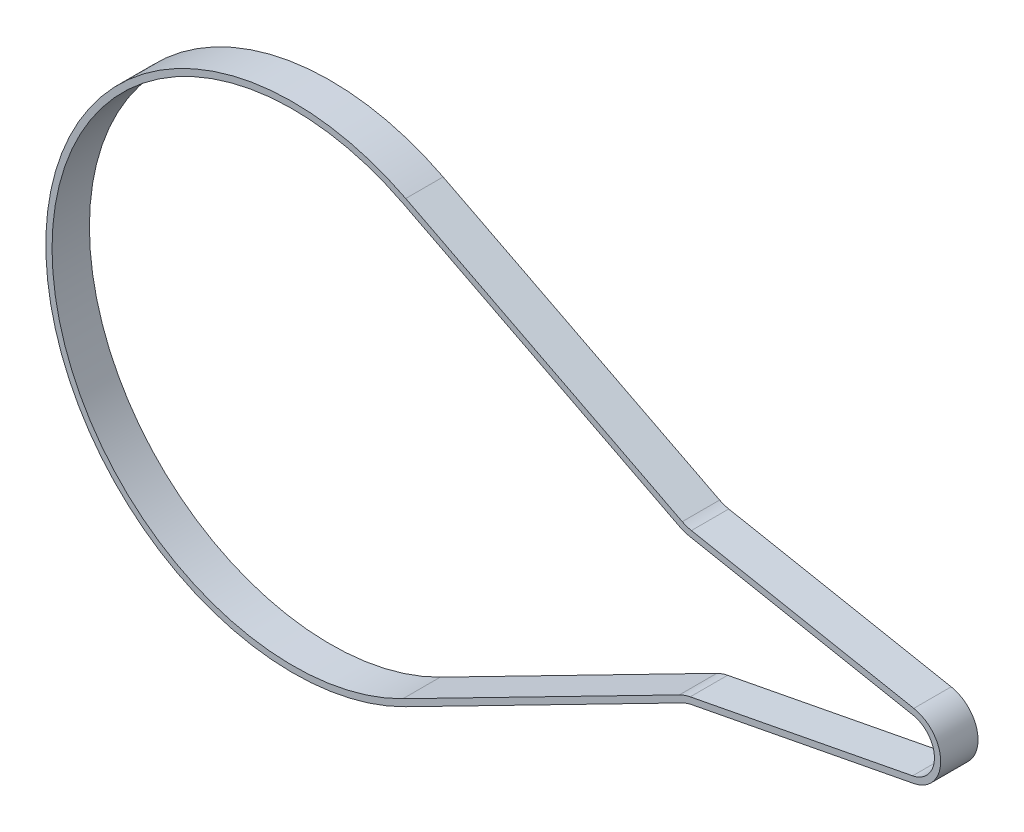
ISO-10303-21;
HEADER;
FILE_DESCRIPTION(('STEP AP214'),'2;1');
FILE_NAME('part.step','',(''),(''),'','','');
FILE_SCHEMA(('AUTOMOTIVE_DESIGN { 1 0 10303 214 1 1 1 1 }'));
ENDSEC;
DATA;
#1=APPLICATION_CONTEXT('core data for automotive mechanical design processes');
#2=APPLICATION_PROTOCOL_DEFINITION('international standard','automotive_design',2000,#1);
#3=PRODUCT_CONTEXT('',#1,'mechanical');
#4=PRODUCT('Part','Part','',(#3));
#5=PRODUCT_RELATED_PRODUCT_CATEGORY('part','',(#4));
#6=PRODUCT_DEFINITION_FORMATION('','',#4);
#7=PRODUCT_DEFINITION_CONTEXT('part definition',#1,'design');
#8=PRODUCT_DEFINITION('design','',#6,#7);
#9=PRODUCT_DEFINITION_SHAPE('','',#8);
#10=(LENGTH_UNIT() NAMED_UNIT(*) SI_UNIT(.MILLI.,.METRE.));
#11=(NAMED_UNIT(*) PLANE_ANGLE_UNIT() SI_UNIT($,.RADIAN.));
#12=(NAMED_UNIT(*) SI_UNIT($,.STERADIAN.) SOLID_ANGLE_UNIT());
#13=UNCERTAINTY_MEASURE_WITH_UNIT(LENGTH_MEASURE(1.E-05),#10,'distance_accuracy_value','');
#14=(GEOMETRIC_REPRESENTATION_CONTEXT(3) GLOBAL_UNCERTAINTY_ASSIGNED_CONTEXT((#13)) GLOBAL_UNIT_ASSIGNED_CONTEXT((#10,
#11,#12)) REPRESENTATION_CONTEXT('',''));
#15=CARTESIAN_POINT('',(0.,0.,0.));
#16=DIRECTION('',(0.,0.,1.));
#17=DIRECTION('',(1.,0.,0.));
#18=AXIS2_PLACEMENT_3D('',#15,#16,#17);
#19=CARTESIAN_POINT('',(-1.11022302462516E-13,35.0000000000002,3.));
#20=DIRECTION('',(0.,0.,1.));
#21=DIRECTION('',(1.,0.,0.));
#22=AXIS2_PLACEMENT_3D('',#19,#20,#21);
#23=PLANE('',#22);
#24=CARTESIAN_POINT('',(-1.11022302462516E-13,35.0000000000002,3.));
#25=DIRECTION('',(0.,0.,1.));
#26=DIRECTION('',(1.,0.,0.));
#27=AXIS2_PLACEMENT_3D('',#24,#25,#26);
#28=CIRCLE('',#27,5.5);
#29=CARTESIAN_POINT('',(-1.0393737461369,29.5991017213949,3.));
#30=VERTEX_POINT('',#29);
#31=CARTESIAN_POINT('',(-2.50670970782606,30.1044503433537,3.));
#32=VERTEX_POINT('',#31);
#33=EDGE_CURVE('E263',#30,#32,#28,.F.);
#34=ORIENTED_EDGE('',*,*,#33,.T.);
#35=DIRECTION('',(-0.89009993757208,0.455765401422902,0.));
#36=VECTOR('',#35,1.);
#37=CARTESIAN_POINT('',(-46.9054299154087,52.8383026715181,3.));
#38=LINE('',#37,#36);
#39=CARTESIAN_POINT('',(-46.9054299154087,52.8383026715181,3.));
#40=VERTEX_POINT('',#39);
#41=EDGE_CURVE('E266',#32,#40,#38,.T.);
#42=ORIENTED_EDGE('',*,*,#41,.T.);
#43=CARTESIAN_POINT('',(-65.0000000000001,17.5000000000002,3.));
#44=DIRECTION('',(0.,0.,1.));
#45=DIRECTION('',(1.,0.,0.));
#46=AXIS2_PLACEMENT_3D('',#43,#44,#45);
#47=CIRCLE('',#46,39.7015);
#48=CARTESIAN_POINT('',(-46.9054299154089,-17.8383026715178,3.));
#49=VERTEX_POINT('',#48);
#50=EDGE_CURVE('E269',#40,#49,#47,.T.);
#51=ORIENTED_EDGE('',*,*,#50,.T.);
#52=DIRECTION('',(0.890099937572082,0.455765401422898,0.));
#53=VECTOR('',#52,1.);
#54=CARTESIAN_POINT('',(-2.50670970782594,4.89554965664645,3.));
#55=LINE('',#54,#53);
#56=CARTESIAN_POINT('',(-2.50670970782594,4.89554965664645,3.));
#57=VERTEX_POINT('',#56);
#58=EDGE_CURVE('E271',#49,#57,#55,.T.);
#59=ORIENTED_EDGE('',*,*,#58,.T.);
#60=CARTESIAN_POINT('',(0.,0.,3.));
#61=DIRECTION('',(0.,0.,1.));
#62=DIRECTION('',(1.,0.,0.));
#63=AXIS2_PLACEMENT_3D('',#60,#61,#62);
#64=CIRCLE('',#63,5.5);
#65=CARTESIAN_POINT('',(-1.03937374613682,5.40089827860528,3.));
#66=VERTEX_POINT('',#65);
#67=EDGE_CURVE('E273',#57,#66,#64,.F.);
#68=ORIENTED_EDGE('',*,*,#67,.T.);
#69=DIRECTION('',(0.981981505200961,0.188977044752149,0.));
#70=VECTOR('',#69,1.);
#71=CARTESIAN_POINT('',(34.6722280006932,12.2734034385681,3.));
#72=LINE('',#71,#70);
#73=CARTESIAN_POINT('',(34.6722280006932,12.2734034385681,3.));
#74=VERTEX_POINT('',#73);
#75=EDGE_CURVE('E275',#66,#74,#72,.T.);
#76=ORIENTED_EDGE('',*,*,#75,.T.);
#77=CARTESIAN_POINT('',(33.6663976799999,17.5000000000002,3.));
#78=DIRECTION('',(0.,0.,1.));
#79=DIRECTION('',(1.,0.,0.));
#80=AXIS2_PLACEMENT_3D('',#77,#78,#79);
#81=CIRCLE('',#80,5.3225);
#82=CARTESIAN_POINT('',(34.6722280006932,22.7265965614323,3.));
#83=VERTEX_POINT('',#82);
#84=EDGE_CURVE('E277',#74,#83,#81,.T.);
#85=ORIENTED_EDGE('',*,*,#84,.T.);
#86=DIRECTION('',(-0.981981505200962,0.188977044752144,0.));
#87=VECTOR('',#86,1.);
#88=CARTESIAN_POINT('',(-1.0393737461369,29.5991017213949,3.));
#89=LINE('',#88,#87);
#90=EDGE_CURVE('E279',#83,#30,#89,.T.);
#91=ORIENTED_EDGE('',*,*,#90,.T.);
#92=EDGE_LOOP('',(#34,#42,#51,#59,#68,#76,#85,#91));
#93=FACE_BOUND('',#92,.T.);
#94=DIRECTION('',(-0.89009993757208,0.455765401422902,0.));
#95=VECTOR('',#94,1.);
#96=CARTESIAN_POINT('',(-47.3611953168316,51.9482027339461,3.));
#97=LINE('',#96,#95);
#98=CARTESIAN_POINT('',(-2.96247510924898,29.2143504057817,3.));
#99=VERTEX_POINT('',#98);
#100=CARTESIAN_POINT('',(-47.3611953168316,51.9482027339461,3.));
#101=VERTEX_POINT('',#100);
#102=EDGE_CURVE('E206',#99,#101,#97,.T.);
#103=ORIENTED_EDGE('',*,*,#102,.F.);
#104=CARTESIAN_POINT('',(-1.11022302462516E-13,35.0000000000002,3.));
#105=DIRECTION('',(0.,0.,-1.));
#106=DIRECTION('',(1.,0.,0.));
#107=AXIS2_PLACEMENT_3D('',#104,#105,#106);
#108=CIRCLE('',#107,6.5);
#109=CARTESIAN_POINT('',(-1.22835079088904,28.6171202161939,3.));
#110=VERTEX_POINT('',#109);
#111=EDGE_CURVE('E198',#110,#99,#108,.T.);
#112=ORIENTED_EDGE('',*,*,#111,.F.);
#113=DIRECTION('',(-0.981981505200962,0.188977044752143,0.));
#114=VECTOR('',#113,1.);
#115=CARTESIAN_POINT('',(-1.22835079088904,28.6171202161939,3.));
#116=LINE('',#115,#114);
#117=CARTESIAN_POINT('',(34.4832509559411,21.7446150562313,3.));
#118=VERTEX_POINT('',#117);
#119=EDGE_CURVE('E231',#118,#110,#116,.T.);
#120=ORIENTED_EDGE('',*,*,#119,.F.);
#121=CARTESIAN_POINT('',(33.6663976799999,17.5000000000002,3.));
#122=DIRECTION('',(0.,0.,1.));
#123=DIRECTION('',(-1.,0.,0.));
#124=AXIS2_PLACEMENT_3D('',#121,#122,#123);
#125=CIRCLE('',#124,4.3225);
#126=CARTESIAN_POINT('',(34.4832509559411,13.255384943769,3.));
#127=VERTEX_POINT('',#126);
#128=EDGE_CURVE('E229',#127,#118,#125,.T.);
#129=ORIENTED_EDGE('',*,*,#128,.F.);
#130=DIRECTION('',(0.981981505200961,0.188977044752149,0.));
#131=VECTOR('',#130,1.);
#132=CARTESIAN_POINT('',(34.4832509559411,13.255384943769,3.));
#133=LINE('',#132,#131);
#134=CARTESIAN_POINT('',(-1.22835079088897,6.38287978380624,3.));
#135=VERTEX_POINT('',#134);
#136=EDGE_CURVE('E227',#135,#127,#133,.T.);
#137=ORIENTED_EDGE('',*,*,#136,.F.);
#138=CARTESIAN_POINT('',(0.,0.,3.));
#139=DIRECTION('',(0.,0.,-1.));
#140=DIRECTION('',(1.,0.,0.));
#141=AXIS2_PLACEMENT_3D('',#138,#139,#140);
#142=CIRCLE('',#141,6.5);
#143=CARTESIAN_POINT('',(-2.96247510924884,5.78564959421853,3.));
#144=VERTEX_POINT('',#143);
#145=EDGE_CURVE('E225',#144,#135,#142,.T.);
#146=ORIENTED_EDGE('',*,*,#145,.F.);
#147=DIRECTION('',(0.890099937572082,0.455765401422898,0.));
#148=VECTOR('',#147,1.);
#149=CARTESIAN_POINT('',(-2.96247510924884,5.78564959421853,3.));
#150=LINE('',#149,#148);
#151=CARTESIAN_POINT('',(-47.3611953168318,-16.9482027339457,3.));
#152=VERTEX_POINT('',#151);
#153=EDGE_CURVE('E221',#152,#144,#150,.T.);
#154=ORIENTED_EDGE('',*,*,#153,.F.);
#155=CARTESIAN_POINT('',(-65.0000000000001,17.5000000000002,3.));
#156=DIRECTION('',(0.,0.,1.));
#157=DIRECTION('',(-1.,0.,0.));
#158=AXIS2_PLACEMENT_3D('',#155,#156,#157);
#159=CIRCLE('',#158,38.7015);
#160=EDGE_CURVE('E219',#101,#152,#159,.T.);
#161=ORIENTED_EDGE('',*,*,#160,.F.);
#162=EDGE_LOOP('',(#103,#112,#120,#129,#137,#146,#154,#161));
#163=FACE_BOUND('',#162,.T.);
#164=ADVANCED_FACE('F85',(#93,#163),#23,.T.);
#165=CARTESIAN_POINT('',(-1.11022302462516E-13,35.0000000000002,-3.));
#166=DIRECTION('',(0.,0.,1.));
#167=DIRECTION('',(1.,0.,0.));
#168=AXIS2_PLACEMENT_3D('',#165,#166,#167);
#169=PLANE('',#168);
#170=CARTESIAN_POINT('',(-1.11022302462516E-13,35.0000000000002,-3.));
#171=DIRECTION('',(0.,0.,1.));
#172=DIRECTION('',(1.,0.,0.));
#173=AXIS2_PLACEMENT_3D('',#170,#171,#172);
#174=CIRCLE('',#173,5.5);
#175=CARTESIAN_POINT('',(-1.0393737461369,29.5991017213949,-3.));
#176=VERTEX_POINT('',#175);
#177=CARTESIAN_POINT('',(-2.50670970782606,30.1044503433537,-3.));
#178=VERTEX_POINT('',#177);
#179=EDGE_CURVE('E214',#176,#178,#174,.F.);
#180=ORIENTED_EDGE('',*,*,#179,.F.);
#181=DIRECTION('',(-0.981981505200962,0.188977044752144,0.));
#182=VECTOR('',#181,1.);
#183=CARTESIAN_POINT('',(-1.0393737461369,29.5991017213949,-3.));
#184=LINE('',#183,#182);
#185=CARTESIAN_POINT('',(34.6722280006932,22.7265965614323,-3.));
#186=VERTEX_POINT('',#185);
#187=EDGE_CURVE('E267',#186,#176,#184,.T.);
#188=ORIENTED_EDGE('',*,*,#187,.F.);
#189=CARTESIAN_POINT('',(33.6663976799999,17.5000000000002,-3.));
#190=DIRECTION('',(0.,0.,1.));
#191=DIRECTION('',(1.,0.,0.));
#192=AXIS2_PLACEMENT_3D('',#189,#190,#191);
#193=CIRCLE('',#192,5.3225);
#194=CARTESIAN_POINT('',(34.6722280006932,12.2734034385681,-3.));
#195=VERTEX_POINT('',#194);
#196=EDGE_CURVE('E294',#195,#186,#193,.T.);
#197=ORIENTED_EDGE('',*,*,#196,.F.);
#198=DIRECTION('',(0.981981505200961,0.188977044752149,0.));
#199=VECTOR('',#198,1.);
#200=CARTESIAN_POINT('',(34.6722280006932,12.2734034385681,-3.));
#201=LINE('',#200,#199);
#202=CARTESIAN_POINT('',(-1.03937374613682,5.40089827860528,-3.));
#203=VERTEX_POINT('',#202);
#204=EDGE_CURVE('E292',#203,#195,#201,.T.);
#205=ORIENTED_EDGE('',*,*,#204,.F.);
#206=CARTESIAN_POINT('',(0.,0.,-3.));
#207=DIRECTION('',(0.,0.,1.));
#208=DIRECTION('',(1.,0.,0.));
#209=AXIS2_PLACEMENT_3D('',#206,#207,#208);
#210=CIRCLE('',#209,5.5);
#211=CARTESIAN_POINT('',(-2.50670970782594,4.89554965664645,-3.));
#212=VERTEX_POINT('',#211);
#213=EDGE_CURVE('E290',#212,#203,#210,.F.);
#214=ORIENTED_EDGE('',*,*,#213,.F.);
#215=DIRECTION('',(0.890099937572082,0.455765401422898,0.));
#216=VECTOR('',#215,1.);
#217=CARTESIAN_POINT('',(-2.50670970782594,4.89554965664645,-3.));
#218=LINE('',#217,#216);
#219=CARTESIAN_POINT('',(-46.9054299154089,-17.8383026715178,-3.));
#220=VERTEX_POINT('',#219);
#221=EDGE_CURVE('E288',#220,#212,#218,.T.);
#222=ORIENTED_EDGE('',*,*,#221,.F.);
#223=CARTESIAN_POINT('',(-65.0000000000001,17.5000000000002,-3.));
#224=DIRECTION('',(0.,0.,1.));
#225=DIRECTION('',(1.,0.,0.));
#226=AXIS2_PLACEMENT_3D('',#223,#224,#225);
#227=CIRCLE('',#226,39.7015);
#228=CARTESIAN_POINT('',(-46.9054299154087,52.8383026715181,-3.));
#229=VERTEX_POINT('',#228);
#230=EDGE_CURVE('E286',#229,#220,#227,.T.);
#231=ORIENTED_EDGE('',*,*,#230,.F.);
#232=DIRECTION('',(-0.89009993757208,0.455765401422902,0.));
#233=VECTOR('',#232,1.);
#234=CARTESIAN_POINT('',(-46.9054299154087,52.8383026715181,-3.));
#235=LINE('',#234,#233);
#236=EDGE_CURVE('E284',#178,#229,#235,.T.);
#237=ORIENTED_EDGE('',*,*,#236,.F.);
#238=EDGE_LOOP('',(#180,#188,#197,#205,#214,#222,#231,#237));
#239=FACE_BOUND('',#238,.T.);
#240=CARTESIAN_POINT('',(-1.11022302462516E-13,35.0000000000002,-3.));
#241=DIRECTION('',(0.,0.,-1.));
#242=DIRECTION('',(1.,0.,0.));
#243=AXIS2_PLACEMENT_3D('',#240,#241,#242);
#244=CIRCLE('',#243,6.5);
#245=CARTESIAN_POINT('',(-1.22835079088904,28.6171202161939,-3.));
#246=VERTEX_POINT('',#245);
#247=CARTESIAN_POINT('',(-2.96247510924898,29.2143504057817,-3.));
#248=VERTEX_POINT('',#247);
#249=EDGE_CURVE('E108',#246,#248,#244,.T.);
#250=ORIENTED_EDGE('',*,*,#249,.T.);
#251=DIRECTION('',(-0.89009993757208,0.455765401422902,0.));
#252=VECTOR('',#251,1.);
#253=CARTESIAN_POINT('',(-47.3611953168316,51.9482027339461,-3.));
#254=LINE('',#253,#252);
#255=CARTESIAN_POINT('',(-47.3611953168316,51.9482027339461,-3.));
#256=VERTEX_POINT('',#255);
#257=EDGE_CURVE('E213',#248,#256,#254,.T.);
#258=ORIENTED_EDGE('',*,*,#257,.T.);
#259=CARTESIAN_POINT('',(-65.0000000000001,17.5000000000002,-3.));
#260=DIRECTION('',(0.,0.,1.));
#261=DIRECTION('',(-1.,0.,0.));
#262=AXIS2_PLACEMENT_3D('',#259,#260,#261);
#263=CIRCLE('',#262,38.7015);
#264=CARTESIAN_POINT('',(-47.3611953168318,-16.9482027339457,-3.));
#265=VERTEX_POINT('',#264);
#266=EDGE_CURVE('E235',#256,#265,#263,.T.);
#267=ORIENTED_EDGE('',*,*,#266,.T.);
#268=DIRECTION('',(0.890099937572082,0.455765401422898,0.));
#269=VECTOR('',#268,1.);
#270=CARTESIAN_POINT('',(-2.96247510924884,5.78564959421853,-3.));
#271=LINE('',#270,#269);
#272=CARTESIAN_POINT('',(-2.96247510924884,5.78564959421853,-3.));
#273=VERTEX_POINT('',#272);
#274=EDGE_CURVE('E238',#265,#273,#271,.T.);
#275=ORIENTED_EDGE('',*,*,#274,.T.);
#276=CARTESIAN_POINT('',(0.,0.,-3.));
#277=DIRECTION('',(0.,0.,-1.));
#278=DIRECTION('',(1.,0.,0.));
#279=AXIS2_PLACEMENT_3D('',#276,#277,#278);
#280=CIRCLE('',#279,6.5);
#281=CARTESIAN_POINT('',(-1.22835079088897,6.38287978380624,-3.));
#282=VERTEX_POINT('',#281);
#283=EDGE_CURVE('E241',#273,#282,#280,.T.);
#284=ORIENTED_EDGE('',*,*,#283,.T.);
#285=DIRECTION('',(0.981981505200961,0.188977044752149,0.));
#286=VECTOR('',#285,1.);
#287=CARTESIAN_POINT('',(34.4832509559411,13.255384943769,-3.));
#288=LINE('',#287,#286);
#289=CARTESIAN_POINT('',(34.4832509559411,13.255384943769,-3.));
#290=VERTEX_POINT('',#289);
#291=EDGE_CURVE('E244',#282,#290,#288,.T.);
#292=ORIENTED_EDGE('',*,*,#291,.T.);
#293=CARTESIAN_POINT('',(33.6663976799999,17.5000000000002,-3.));
#294=DIRECTION('',(0.,0.,1.));
#295=DIRECTION('',(-1.,0.,0.));
#296=AXIS2_PLACEMENT_3D('',#293,#294,#295);
#297=CIRCLE('',#296,4.3225);
#298=CARTESIAN_POINT('',(34.483250955941,21.7446150562313,-3.));
#299=VERTEX_POINT('',#298);
#300=EDGE_CURVE('E247',#290,#299,#297,.T.);
#301=ORIENTED_EDGE('',*,*,#300,.T.);
#302=DIRECTION('',(-0.981981505200962,0.188977044752143,0.));
#303=VECTOR('',#302,1.);
#304=CARTESIAN_POINT('',(-1.22835079088904,28.6171202161939,-3.));
#305=LINE('',#304,#303);
#306=EDGE_CURVE('E207',#299,#246,#305,.T.);
#307=ORIENTED_EDGE('',*,*,#306,.T.);
#308=EDGE_LOOP('',(#250,#258,#267,#275,#284,#292,#301,#307));
#309=FACE_BOUND('',#308,.T.);
#310=ADVANCED_FACE('F324',(#239,#309),#169,.F.);
#311=CARTESIAN_POINT('',(-1.11022302462516E-13,35.0000000000002,3.));
#312=DIRECTION('',(0.,0.,-1.));
#313=DIRECTION('',(-1.,0.,0.));
#314=AXIS2_PLACEMENT_3D('',#311,#312,#313);
#315=CYLINDRICAL_SURFACE('',#314,5.5);
#316=ORIENTED_EDGE('',*,*,#179,.T.);
#317=DIRECTION('',(0.,0.,-1.));
#318=VECTOR('',#317,1.);
#319=CARTESIAN_POINT('',(-2.50670970782606,30.1044503433537,3.));
#320=LINE('',#319,#318);
#321=EDGE_CURVE('E12',#32,#178,#320,.T.);
#322=ORIENTED_EDGE('',*,*,#321,.F.);
#323=ORIENTED_EDGE('',*,*,#33,.F.);
#324=DIRECTION('',(0.,0.,-1.));
#325=VECTOR('',#324,1.);
#326=CARTESIAN_POINT('',(-1.0393737461369,29.5991017213949,3.));
#327=LINE('',#326,#325);
#328=EDGE_CURVE('E281',#30,#176,#327,.T.);
#329=ORIENTED_EDGE('',*,*,#328,.T.);
#330=EDGE_LOOP('',(#316,#322,#323,#329));
#331=FACE_BOUND('',#330,.T.);
#332=ADVANCED_FACE('F87',(#331),#315,.F.);
#333=CARTESIAN_POINT('',(-46.9054299154087,52.8383026715181,3.));
#334=DIRECTION('',(-0.455765401422902,-0.89009993757208,0.));
#335=DIRECTION('',(0.89009993757208,-0.455765401422902,0.));
#336=AXIS2_PLACEMENT_3D('',#333,#334,#335);
#337=PLANE('',#336);
#338=ORIENTED_EDGE('',*,*,#236,.T.);
#339=DIRECTION('',(0.,0.,-1.));
#340=VECTOR('',#339,1.);
#341=CARTESIAN_POINT('',(-46.9054299154087,52.8383026715181,3.));
#342=LINE('',#341,#340);
#343=EDGE_CURVE('E93',#40,#229,#342,.T.);
#344=ORIENTED_EDGE('',*,*,#343,.F.);
#345=ORIENTED_EDGE('',*,*,#41,.F.);
#346=ORIENTED_EDGE('',*,*,#321,.T.);
#347=EDGE_LOOP('',(#338,#344,#345,#346));
#348=FACE_BOUND('',#347,.T.);
#349=ADVANCED_FACE('F341',(#348),#337,.F.);
#350=CARTESIAN_POINT('',(-65.0000000000001,17.5000000000002,3.));
#351=DIRECTION('',(0.,0.,-1.));
#352=DIRECTION('',(-1.,0.,0.));
#353=AXIS2_PLACEMENT_3D('',#350,#351,#352);
#354=CYLINDRICAL_SURFACE('',#353,39.7015);
#355=ORIENTED_EDGE('',*,*,#230,.T.);
#356=DIRECTION('',(0.,0.,-1.));
#357=VECTOR('',#356,1.);
#358=CARTESIAN_POINT('',(-46.9054299154089,-17.8383026715178,3.));
#359=LINE('',#358,#357);
#360=EDGE_CURVE('E311',#49,#220,#359,.T.);
#361=ORIENTED_EDGE('',*,*,#360,.F.);
#362=ORIENTED_EDGE('',*,*,#50,.F.);
#363=ORIENTED_EDGE('',*,*,#343,.T.);
#364=EDGE_LOOP('',(#355,#361,#362,#363));
#365=FACE_BOUND('',#364,.T.);
#366=ADVANCED_FACE('F318',(#365),#354,.T.);
#367=CARTESIAN_POINT('',(-2.50670970782594,4.89554965664645,3.));
#368=DIRECTION('',(-0.455765401422898,0.890099937572082,0.));
#369=DIRECTION('',(-0.890099937572082,-0.455765401422898,0.));
#370=AXIS2_PLACEMENT_3D('',#367,#368,#369);
#371=PLANE('',#370);
#372=ORIENTED_EDGE('',*,*,#221,.T.);
#373=DIRECTION('',(0.,0.,-1.));
#374=VECTOR('',#373,1.);
#375=CARTESIAN_POINT('',(-2.50670970782594,4.89554965664645,3.));
#376=LINE('',#375,#374);
#377=EDGE_CURVE('E308',#57,#212,#376,.T.);
#378=ORIENTED_EDGE('',*,*,#377,.F.);
#379=ORIENTED_EDGE('',*,*,#58,.F.);
#380=ORIENTED_EDGE('',*,*,#360,.T.);
#381=EDGE_LOOP('',(#372,#378,#379,#380));
#382=FACE_BOUND('',#381,.T.);
#383=ADVANCED_FACE('F330',(#382),#371,.F.);
#384=CARTESIAN_POINT('',(0.,0.,3.));
#385=DIRECTION('',(0.,0.,-1.));
#386=DIRECTION('',(-1.,0.,0.));
#387=AXIS2_PLACEMENT_3D('',#384,#385,#386);
#388=CYLINDRICAL_SURFACE('',#387,5.5);
#389=ORIENTED_EDGE('',*,*,#213,.T.);
#390=DIRECTION('',(0.,0.,-1.));
#391=VECTOR('',#390,1.);
#392=CARTESIAN_POINT('',(-1.03937374613682,5.40089827860528,3.));
#393=LINE('',#392,#391);
#394=EDGE_CURVE('E305',#66,#203,#393,.T.);
#395=ORIENTED_EDGE('',*,*,#394,.F.);
#396=ORIENTED_EDGE('',*,*,#67,.F.);
#397=ORIENTED_EDGE('',*,*,#377,.T.);
#398=EDGE_LOOP('',(#389,#395,#396,#397));
#399=FACE_BOUND('',#398,.T.);
#400=ADVANCED_FACE('F334',(#399),#388,.F.);
#401=CARTESIAN_POINT('',(34.6722280006932,12.2734034385681,3.));
#402=DIRECTION('',(-0.188977044752149,0.981981505200961,0.));
#403=DIRECTION('',(-0.981981505200961,-0.188977044752149,0.));
#404=AXIS2_PLACEMENT_3D('',#401,#402,#403);
#405=PLANE('',#404);
#406=ORIENTED_EDGE('',*,*,#204,.T.);
#407=DIRECTION('',(0.,0.,-1.));
#408=VECTOR('',#407,1.);
#409=CARTESIAN_POINT('',(34.6722280006932,12.2734034385681,3.));
#410=LINE('',#409,#408);
#411=EDGE_CURVE('E302',#74,#195,#410,.T.);
#412=ORIENTED_EDGE('',*,*,#411,.F.);
#413=ORIENTED_EDGE('',*,*,#75,.F.);
#414=ORIENTED_EDGE('',*,*,#394,.T.);
#415=EDGE_LOOP('',(#406,#412,#413,#414));
#416=FACE_BOUND('',#415,.T.);
#417=ADVANCED_FACE('F354',(#416),#405,.F.);
#418=CARTESIAN_POINT('',(33.6663976799999,17.5000000000002,3.));
#419=DIRECTION('',(0.,0.,-1.));
#420=DIRECTION('',(-1.,0.,0.));
#421=AXIS2_PLACEMENT_3D('',#418,#419,#420);
#422=CYLINDRICAL_SURFACE('',#421,5.3225);
#423=ORIENTED_EDGE('',*,*,#196,.T.);
#424=DIRECTION('',(0.,0.,-1.));
#425=VECTOR('',#424,1.);
#426=CARTESIAN_POINT('',(34.6722280006932,22.7265965614323,3.));
#427=LINE('',#426,#425);
#428=EDGE_CURVE('E299',#83,#186,#427,.T.);
#429=ORIENTED_EDGE('',*,*,#428,.F.);
#430=ORIENTED_EDGE('',*,*,#84,.F.);
#431=ORIENTED_EDGE('',*,*,#411,.T.);
#432=EDGE_LOOP('',(#423,#429,#430,#431));
#433=FACE_BOUND('',#432,.T.);
#434=ADVANCED_FACE('F352',(#433),#422,.T.);
#435=CARTESIAN_POINT('',(-1.0393737461369,29.5991017213949,3.));
#436=DIRECTION('',(-0.188977044752143,-0.981981505200962,0.));
#437=DIRECTION('',(0.981981505200962,-0.188977044752143,0.));
#438=AXIS2_PLACEMENT_3D('',#435,#436,#437);
#439=PLANE('',#438);
#440=ORIENTED_EDGE('',*,*,#187,.T.);
#441=ORIENTED_EDGE('',*,*,#328,.F.);
#442=ORIENTED_EDGE('',*,*,#90,.F.);
#443=ORIENTED_EDGE('',*,*,#428,.T.);
#444=EDGE_LOOP('',(#440,#441,#442,#443));
#445=FACE_BOUND('',#444,.T.);
#446=ADVANCED_FACE('F347',(#445),#439,.F.);
#447=CARTESIAN_POINT('',(-1.11022302462516E-13,35.0000000000002,3.));
#448=DIRECTION('',(0.,0.,-1.));
#449=DIRECTION('',(-1.,0.,0.));
#450=AXIS2_PLACEMENT_3D('',#447,#448,#449);
#451=CYLINDRICAL_SURFACE('',#450,6.5);
#452=ORIENTED_EDGE('',*,*,#249,.F.);
#453=DIRECTION('',(0.,0.,-1.));
#454=VECTOR('',#453,1.);
#455=CARTESIAN_POINT('',(-1.22835079088904,28.6171202161939,3.));
#456=LINE('',#455,#454);
#457=EDGE_CURVE('E202',#110,#246,#456,.T.);
#458=ORIENTED_EDGE('',*,*,#457,.F.);
#459=ORIENTED_EDGE('',*,*,#111,.T.);
#460=DIRECTION('',(0.,0.,-1.));
#461=VECTOR('',#460,1.);
#462=CARTESIAN_POINT('',(-2.96247510924898,29.2143504057817,3.));
#463=LINE('',#462,#461);
#464=EDGE_CURVE('E201',#99,#248,#463,.T.);
#465=ORIENTED_EDGE('',*,*,#464,.T.);
#466=EDGE_LOOP('',(#452,#458,#459,#465));
#467=FACE_BOUND('',#466,.T.);
#468=ADVANCED_FACE('F200',(#467),#451,.T.);
#469=CARTESIAN_POINT('',(-47.3611953168316,51.9482027339461,3.));
#470=DIRECTION('',(-0.455765401422902,-0.89009993757208,0.));
#471=DIRECTION('',(0.89009993757208,-0.455765401422902,0.));
#472=AXIS2_PLACEMENT_3D('',#469,#470,#471);
#473=PLANE('',#472);
#474=ORIENTED_EDGE('',*,*,#257,.F.);
#475=ORIENTED_EDGE('',*,*,#464,.F.);
#476=ORIENTED_EDGE('',*,*,#102,.T.);
#477=DIRECTION('',(0.,0.,-1.));
#478=VECTOR('',#477,1.);
#479=CARTESIAN_POINT('',(-47.3611953168316,51.9482027339461,3.));
#480=LINE('',#479,#478);
#481=EDGE_CURVE('E215',#101,#256,#480,.T.);
#482=ORIENTED_EDGE('',*,*,#481,.T.);
#483=EDGE_LOOP('',(#474,#475,#476,#482));
#484=FACE_BOUND('',#483,.T.);
#485=ADVANCED_FACE('F210',(#484),#473,.T.);
#486=CARTESIAN_POINT('',(-65.0000000000001,17.5000000000002,3.));
#487=DIRECTION('',(0.,0.,-1.));
#488=DIRECTION('',(-1.,0.,0.));
#489=AXIS2_PLACEMENT_3D('',#486,#487,#488);
#490=CYLINDRICAL_SURFACE('',#489,38.7015);
#491=ORIENTED_EDGE('',*,*,#266,.F.);
#492=ORIENTED_EDGE('',*,*,#481,.F.);
#493=ORIENTED_EDGE('',*,*,#160,.T.);
#494=DIRECTION('',(0.,0.,-1.));
#495=VECTOR('',#494,1.);
#496=CARTESIAN_POINT('',(-47.3611953168318,-16.9482027339457,3.));
#497=LINE('',#496,#495);
#498=EDGE_CURVE('E260',#152,#265,#497,.T.);
#499=ORIENTED_EDGE('',*,*,#498,.T.);
#500=EDGE_LOOP('',(#491,#492,#493,#499));
#501=FACE_BOUND('',#500,.T.);
#502=ADVANCED_FACE('F379',(#501),#490,.F.);
#503=CARTESIAN_POINT('',(-2.96247510924884,5.78564959421853,3.));
#504=DIRECTION('',(-0.455765401422898,0.890099937572082,0.));
#505=DIRECTION('',(-0.890099937572082,-0.455765401422898,0.));
#506=AXIS2_PLACEMENT_3D('',#503,#504,#505);
#507=PLANE('',#506);
#508=ORIENTED_EDGE('',*,*,#274,.F.);
#509=ORIENTED_EDGE('',*,*,#498,.F.);
#510=ORIENTED_EDGE('',*,*,#153,.T.);
#511=DIRECTION('',(0.,0.,-1.));
#512=VECTOR('',#511,1.);
#513=CARTESIAN_POINT('',(-2.96247510924884,5.78564959421853,3.));
#514=LINE('',#513,#512);
#515=EDGE_CURVE('E258',#144,#273,#514,.T.);
#516=ORIENTED_EDGE('',*,*,#515,.T.);
#517=EDGE_LOOP('',(#508,#509,#510,#516));
#518=FACE_BOUND('',#517,.T.);
#519=ADVANCED_FACE('F383',(#518),#507,.T.);
#520=CARTESIAN_POINT('',(0.,0.,3.));
#521=DIRECTION('',(0.,0.,-1.));
#522=DIRECTION('',(-1.,0.,0.));
#523=AXIS2_PLACEMENT_3D('',#520,#521,#522);
#524=CYLINDRICAL_SURFACE('',#523,6.5);
#525=ORIENTED_EDGE('',*,*,#283,.F.);
#526=ORIENTED_EDGE('',*,*,#515,.F.);
#527=ORIENTED_EDGE('',*,*,#145,.T.);
#528=DIRECTION('',(0.,0.,-1.));
#529=VECTOR('',#528,1.);
#530=CARTESIAN_POINT('',(-1.22835079088897,6.38287978380624,3.));
#531=LINE('',#530,#529);
#532=EDGE_CURVE('E256',#135,#282,#531,.T.);
#533=ORIENTED_EDGE('',*,*,#532,.T.);
#534=EDGE_LOOP('',(#525,#526,#527,#533));
#535=FACE_BOUND('',#534,.T.);
#536=ADVANCED_FACE('F389',(#535),#524,.T.);
#537=CARTESIAN_POINT('',(34.4832509559411,13.255384943769,3.));
#538=DIRECTION('',(-0.188977044752149,0.981981505200961,0.));
#539=DIRECTION('',(-0.981981505200961,-0.188977044752149,0.));
#540=AXIS2_PLACEMENT_3D('',#537,#538,#539);
#541=PLANE('',#540);
#542=ORIENTED_EDGE('',*,*,#291,.F.);
#543=ORIENTED_EDGE('',*,*,#532,.F.);
#544=ORIENTED_EDGE('',*,*,#136,.T.);
#545=DIRECTION('',(0.,0.,-1.));
#546=VECTOR('',#545,1.);
#547=CARTESIAN_POINT('',(34.4832509559411,13.255384943769,3.));
#548=LINE('',#547,#546);
#549=EDGE_CURVE('E254',#127,#290,#548,.T.);
#550=ORIENTED_EDGE('',*,*,#549,.T.);
#551=EDGE_LOOP('',(#542,#543,#544,#550));
#552=FACE_BOUND('',#551,.T.);
#553=ADVANCED_FACE('F393',(#552),#541,.T.);
#554=CARTESIAN_POINT('',(33.6663976799999,17.5000000000002,3.));
#555=DIRECTION('',(0.,0.,-1.));
#556=DIRECTION('',(-1.,0.,0.));
#557=AXIS2_PLACEMENT_3D('',#554,#555,#556);
#558=CYLINDRICAL_SURFACE('',#557,4.3225);
#559=ORIENTED_EDGE('',*,*,#300,.F.);
#560=ORIENTED_EDGE('',*,*,#549,.F.);
#561=ORIENTED_EDGE('',*,*,#128,.T.);
#562=DIRECTION('',(0.,0.,-1.));
#563=VECTOR('',#562,1.);
#564=CARTESIAN_POINT('',(34.483250955941,21.7446150562313,3.));
#565=LINE('',#564,#563);
#566=EDGE_CURVE('E100',#118,#299,#565,.T.);
#567=ORIENTED_EDGE('',*,*,#566,.T.);
#568=EDGE_LOOP('',(#559,#560,#561,#567));
#569=FACE_BOUND('',#568,.T.);
#570=ADVANCED_FACE('F397',(#569),#558,.F.);
#571=CARTESIAN_POINT('',(-1.22835079088904,28.6171202161939,3.));
#572=DIRECTION('',(-0.188977044752143,-0.981981505200962,0.));
#573=DIRECTION('',(0.981981505200962,-0.188977044752143,0.));
#574=AXIS2_PLACEMENT_3D('',#571,#572,#573);
#575=PLANE('',#574);
#576=ORIENTED_EDGE('',*,*,#306,.F.);
#577=ORIENTED_EDGE('',*,*,#566,.F.);
#578=ORIENTED_EDGE('',*,*,#119,.T.);
#579=ORIENTED_EDGE('',*,*,#457,.T.);
#580=EDGE_LOOP('',(#576,#577,#578,#579));
#581=FACE_BOUND('',#580,.T.);
#582=ADVANCED_FACE('F401',(#581),#575,.T.);
#583=CLOSED_SHELL('',(#164,#310,#332,#349,#366,#383,#400,#417,#434,#446,#468,#485,#502,#519,
#536,#553,#570,#582));
#584=MANIFOLD_SOLID_BREP('B2',#583);
#585=ADVANCED_BREP_SHAPE_REPRESENTATION('',(#18,#584),#14);
#586=SHAPE_DEFINITION_REPRESENTATION(#9,#585);
ENDSEC;
END-ISO-10303-21;
